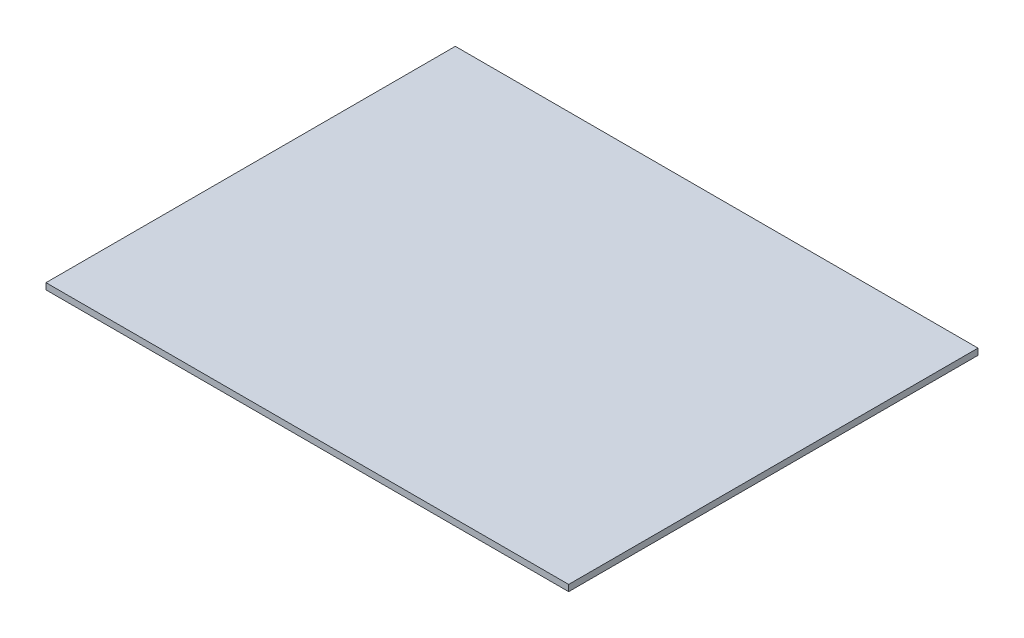
ISO-10303-21;
HEADER;
FILE_DESCRIPTION(('STEP AP214'),'2;1');
FILE_NAME('part.step','',(''),(''),'','','');
FILE_SCHEMA(('AUTOMOTIVE_DESIGN { 1 0 10303 214 1 1 1 1 }'));
ENDSEC;
DATA;
#1=APPLICATION_CONTEXT('core data for automotive mechanical design processes');
#2=APPLICATION_PROTOCOL_DEFINITION('international standard','automotive_design',2000,#1);
#3=PRODUCT_CONTEXT('',#1,'mechanical');
#4=PRODUCT('Part','Part','',(#3));
#5=PRODUCT_RELATED_PRODUCT_CATEGORY('part','',(#4));
#6=PRODUCT_DEFINITION_FORMATION('','',#4);
#7=PRODUCT_DEFINITION_CONTEXT('part definition',#1,'design');
#8=PRODUCT_DEFINITION('design','',#6,#7);
#9=PRODUCT_DEFINITION_SHAPE('','',#8);
#10=(LENGTH_UNIT() NAMED_UNIT(*) SI_UNIT(.MILLI.,.METRE.));
#11=(NAMED_UNIT(*) PLANE_ANGLE_UNIT() SI_UNIT($,.RADIAN.));
#12=(NAMED_UNIT(*) SI_UNIT($,.STERADIAN.) SOLID_ANGLE_UNIT());
#13=UNCERTAINTY_MEASURE_WITH_UNIT(LENGTH_MEASURE(1.E-05),#10,'distance_accuracy_value','');
#14=(GEOMETRIC_REPRESENTATION_CONTEXT(3) GLOBAL_UNCERTAINTY_ASSIGNED_CONTEXT((#13)) GLOBAL_UNIT_ASSIGNED_CONTEXT((#10,
#11,#12)) REPRESENTATION_CONTEXT('',''));
#15=CARTESIAN_POINT('',(0.,0.,0.));
#16=DIRECTION('',(0.,0.,1.));
#17=DIRECTION('',(1.,0.,0.));
#18=AXIS2_PLACEMENT_3D('',#15,#16,#17);
#19=CARTESIAN_POINT('',(105.41,2.54,82.55));
#20=DIRECTION('',(-1.,0.,0.));
#21=DIRECTION('',(0.,0.,1.));
#22=AXIS2_PLACEMENT_3D('',#19,#20,#21);
#23=PLANE('',#22);
#24=DIRECTION('',(0.,0.,-1.));
#25=VECTOR('',#24,1.);
#26=CARTESIAN_POINT('',(105.41,0.,82.55));
#27=LINE('',#26,#25);
#28=CARTESIAN_POINT('',(105.41,0.,82.55));
#29=VERTEX_POINT('',#28);
#30=CARTESIAN_POINT('',(105.41,0.,-82.55));
#31=VERTEX_POINT('',#30);
#32=EDGE_CURVE('E96',#29,#31,#27,.T.);
#33=ORIENTED_EDGE('',*,*,#32,.T.);
#34=DIRECTION('',(0.,-1.,0.));
#35=VECTOR('',#34,1.);
#36=CARTESIAN_POINT('',(105.41,2.54,-82.55));
#37=LINE('',#36,#35);
#38=CARTESIAN_POINT('',(105.41,2.54,-82.55));
#39=VERTEX_POINT('',#38);
#40=EDGE_CURVE('E11',#39,#31,#37,.T.);
#41=ORIENTED_EDGE('',*,*,#40,.F.);
#42=DIRECTION('',(0.,0.,-1.));
#43=VECTOR('',#42,1.);
#44=CARTESIAN_POINT('',(105.41,2.54,82.55));
#45=LINE('',#44,#43);
#46=CARTESIAN_POINT('',(105.41,2.54,82.55));
#47=VERTEX_POINT('',#46);
#48=EDGE_CURVE('E84',#47,#39,#45,.T.);
#49=ORIENTED_EDGE('',*,*,#48,.F.);
#50=DIRECTION('',(0.,-1.,0.));
#51=VECTOR('',#50,1.);
#52=CARTESIAN_POINT('',(105.41,2.54,82.55));
#53=LINE('',#52,#51);
#54=EDGE_CURVE('E92',#47,#29,#53,.T.);
#55=ORIENTED_EDGE('',*,*,#54,.T.);
#56=EDGE_LOOP('',(#33,#41,#49,#55));
#57=FACE_BOUND('',#56,.T.);
#58=ADVANCED_FACE('F33',(#57),#23,.F.);
#59=CARTESIAN_POINT('',(-105.41,2.54,-82.55));
#60=DIRECTION('',(0.,0.,1.));
#61=DIRECTION('',(1.,0.,0.));
#62=AXIS2_PLACEMENT_3D('',#59,#60,#61);
#63=PLANE('',#62);
#64=DIRECTION('',(-1.,0.,0.));
#65=VECTOR('',#64,1.);
#66=CARTESIAN_POINT('',(-105.41,0.,-82.55));
#67=LINE('',#66,#65);
#68=CARTESIAN_POINT('',(-105.41,0.,-82.55));
#69=VERTEX_POINT('',#68);
#70=EDGE_CURVE('E88',#31,#69,#67,.T.);
#71=ORIENTED_EDGE('',*,*,#70,.T.);
#72=DIRECTION('',(0.,-1.,0.));
#73=VECTOR('',#72,1.);
#74=CARTESIAN_POINT('',(-105.41,2.54,-82.55));
#75=LINE('',#74,#73);
#76=CARTESIAN_POINT('',(-105.41,2.54,-82.55));
#77=VERTEX_POINT('',#76);
#78=EDGE_CURVE('E41',#77,#69,#75,.T.);
#79=ORIENTED_EDGE('',*,*,#78,.F.);
#80=DIRECTION('',(-1.,0.,0.));
#81=VECTOR('',#80,1.);
#82=CARTESIAN_POINT('',(-105.41,2.54,-82.55));
#83=LINE('',#82,#81);
#84=EDGE_CURVE('E79',#39,#77,#83,.T.);
#85=ORIENTED_EDGE('',*,*,#84,.F.);
#86=ORIENTED_EDGE('',*,*,#40,.T.);
#87=EDGE_LOOP('',(#71,#79,#85,#86));
#88=FACE_BOUND('',#87,.T.);
#89=ADVANCED_FACE('F87',(#88),#63,.F.);
#90=CARTESIAN_POINT('',(-105.41,2.54,82.55));
#91=DIRECTION('',(1.,0.,0.));
#92=DIRECTION('',(0.,0.,-1.));
#93=AXIS2_PLACEMENT_3D('',#90,#91,#92);
#94=PLANE('',#93);
#95=DIRECTION('',(0.,0.,1.));
#96=VECTOR('',#95,1.);
#97=CARTESIAN_POINT('',(-105.41,0.,82.55));
#98=LINE('',#97,#96);
#99=CARTESIAN_POINT('',(-105.41,0.,82.55));
#100=VERTEX_POINT('',#99);
#101=EDGE_CURVE('E66',#69,#100,#98,.T.);
#102=ORIENTED_EDGE('',*,*,#101,.T.);
#103=DIRECTION('',(0.,-1.,0.));
#104=VECTOR('',#103,1.);
#105=CARTESIAN_POINT('',(-105.41,2.54,82.55));
#106=LINE('',#105,#104);
#107=CARTESIAN_POINT('',(-105.41,2.54,82.55));
#108=VERTEX_POINT('',#107);
#109=EDGE_CURVE('E89',#108,#100,#106,.T.);
#110=ORIENTED_EDGE('',*,*,#109,.F.);
#111=DIRECTION('',(0.,0.,1.));
#112=VECTOR('',#111,1.);
#113=CARTESIAN_POINT('',(-105.41,2.54,82.55));
#114=LINE('',#113,#112);
#115=EDGE_CURVE('E82',#77,#108,#114,.T.);
#116=ORIENTED_EDGE('',*,*,#115,.F.);
#117=ORIENTED_EDGE('',*,*,#78,.T.);
#118=EDGE_LOOP('',(#102,#110,#116,#117));
#119=FACE_BOUND('',#118,.T.);
#120=ADVANCED_FACE('F90',(#119),#94,.F.);
#121=CARTESIAN_POINT('',(-105.41,2.54,82.55));
#122=DIRECTION('',(0.,0.,-1.));
#123=DIRECTION('',(-1.,0.,0.));
#124=AXIS2_PLACEMENT_3D('',#121,#122,#123);
#125=PLANE('',#124);
#126=DIRECTION('',(1.,0.,0.));
#127=VECTOR('',#126,1.);
#128=CARTESIAN_POINT('',(-105.41,0.,82.55));
#129=LINE('',#128,#127);
#130=EDGE_CURVE('E72',#100,#29,#129,.T.);
#131=ORIENTED_EDGE('',*,*,#130,.T.);
#132=ORIENTED_EDGE('',*,*,#54,.F.);
#133=DIRECTION('',(1.,0.,0.));
#134=VECTOR('',#133,1.);
#135=CARTESIAN_POINT('',(-105.41,2.54,82.55));
#136=LINE('',#135,#134);
#137=EDGE_CURVE('E49',#108,#47,#136,.T.);
#138=ORIENTED_EDGE('',*,*,#137,.F.);
#139=ORIENTED_EDGE('',*,*,#109,.T.);
#140=EDGE_LOOP('',(#131,#132,#138,#139));
#141=FACE_BOUND('',#140,.T.);
#142=ADVANCED_FACE('F103',(#141),#125,.F.);
#143=CARTESIAN_POINT('',(0.,2.54,0.));
#144=DIRECTION('',(0.,-1.,0.));
#145=DIRECTION('',(0.,0.,-1.));
#146=AXIS2_PLACEMENT_3D('',#143,#144,#145);
#147=PLANE('',#146);
#148=ORIENTED_EDGE('',*,*,#48,.T.);
#149=ORIENTED_EDGE('',*,*,#84,.T.);
#150=ORIENTED_EDGE('',*,*,#115,.T.);
#151=ORIENTED_EDGE('',*,*,#137,.T.);
#152=EDGE_LOOP('',(#148,#149,#150,#151));
#153=FACE_BOUND('',#152,.T.);
#154=ADVANCED_FACE('F80',(#153),#147,.F.);
#155=CARTESIAN_POINT('',(0.,0.,0.));
#156=DIRECTION('',(0.,-1.,0.));
#157=DIRECTION('',(0.,0.,-1.));
#158=AXIS2_PLACEMENT_3D('',#155,#156,#157);
#159=PLANE('',#158);
#160=ORIENTED_EDGE('',*,*,#32,.F.);
#161=ORIENTED_EDGE('',*,*,#130,.F.);
#162=ORIENTED_EDGE('',*,*,#101,.F.);
#163=ORIENTED_EDGE('',*,*,#70,.F.);
#164=EDGE_LOOP('',(#160,#161,#162,#163));
#165=FACE_BOUND('',#164,.T.);
#166=ADVANCED_FACE('F106',(#165),#159,.T.);
#167=CLOSED_SHELL('',(#58,#89,#120,#142,#154,#166));
#168=MANIFOLD_SOLID_BREP('B2',#167);
#169=ADVANCED_BREP_SHAPE_REPRESENTATION('',(#18,#168),#14);
#170=SHAPE_DEFINITION_REPRESENTATION(#9,#169);
ENDSEC;
END-ISO-10303-21;
